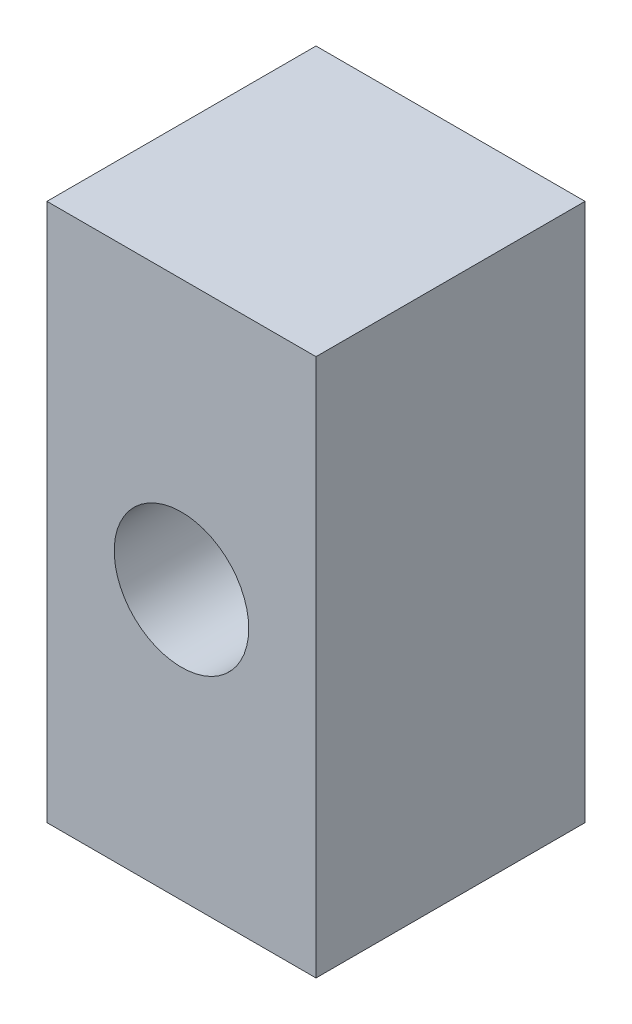
ISO-10303-21;
HEADER;
FILE_DESCRIPTION(('STEP AP214'),'2;1');
FILE_NAME('part.step','',(''),(''),'','','');
FILE_SCHEMA(('AUTOMOTIVE_DESIGN { 1 0 10303 214 1 1 1 1 }'));
ENDSEC;
DATA;
#1=APPLICATION_CONTEXT('core data for automotive mechanical design processes');
#2=APPLICATION_PROTOCOL_DEFINITION('international standard','automotive_design',2000,#1);
#3=PRODUCT_CONTEXT('',#1,'mechanical');
#4=PRODUCT('Part','Part','',(#3));
#5=PRODUCT_RELATED_PRODUCT_CATEGORY('part','',(#4));
#6=PRODUCT_DEFINITION_FORMATION('','',#4);
#7=PRODUCT_DEFINITION_CONTEXT('part definition',#1,'design');
#8=PRODUCT_DEFINITION('design','',#6,#7);
#9=PRODUCT_DEFINITION_SHAPE('','',#8);
#10=(LENGTH_UNIT() NAMED_UNIT(*) SI_UNIT(.MILLI.,.METRE.));
#11=(NAMED_UNIT(*) PLANE_ANGLE_UNIT() SI_UNIT($,.RADIAN.));
#12=(NAMED_UNIT(*) SI_UNIT($,.STERADIAN.) SOLID_ANGLE_UNIT());
#13=UNCERTAINTY_MEASURE_WITH_UNIT(LENGTH_MEASURE(1.E-05),#10,'distance_accuracy_value','');
#14=(GEOMETRIC_REPRESENTATION_CONTEXT(3) GLOBAL_UNCERTAINTY_ASSIGNED_CONTEXT((#13)) GLOBAL_UNIT_ASSIGNED_CONTEXT((#10,
#11,#12)) REPRESENTATION_CONTEXT('',''));
#15=CARTESIAN_POINT('',(0.,0.,0.));
#16=DIRECTION('',(0.,0.,1.));
#17=DIRECTION('',(1.,0.,0.));
#18=AXIS2_PLACEMENT_3D('',#15,#16,#17);
#19=CARTESIAN_POINT('',(0.,0.,50.8));
#20=DIRECTION('',(0.,0.,1.));
#21=DIRECTION('',(1.,0.,0.));
#22=AXIS2_PLACEMENT_3D('',#19,#20,#21);
#23=PLANE('',#22);
#24=DIRECTION('',(0.,-1.,0.));
#25=VECTOR('',#24,1.);
#26=CARTESIAN_POINT('',(-43.7730805506902,40.0458599995508,50.8));
#27=LINE('',#26,#25);
#28=CARTESIAN_POINT('',(-43.7730805506902,40.0458599995508,50.8));
#29=VERTEX_POINT('',#28);
#30=CARTESIAN_POINT('',(-43.7730805506902,-61.5541400004492,50.8));
#31=VERTEX_POINT('',#30);
#32=EDGE_CURVE('E85',#29,#31,#27,.T.);
#33=ORIENTED_EDGE('',*,*,#32,.T.);
#34=DIRECTION('',(1.,0.,0.));
#35=VECTOR('',#34,1.);
#36=CARTESIAN_POINT('',(-43.7730805506902,-61.5541400004492,50.8));
#37=LINE('',#36,#35);
#38=CARTESIAN_POINT('',(7.02691944930985,-61.5541400004492,50.8));
#39=VERTEX_POINT('',#38);
#40=EDGE_CURVE('E80',#31,#39,#37,.T.);
#41=ORIENTED_EDGE('',*,*,#40,.T.);
#42=DIRECTION('',(0.,1.,0.));
#43=VECTOR('',#42,1.);
#44=CARTESIAN_POINT('',(7.02691944930984,40.0458599995508,50.8));
#45=LINE('',#44,#43);
#46=CARTESIAN_POINT('',(7.02691944930984,40.0458599995508,50.8));
#47=VERTEX_POINT('',#46);
#48=EDGE_CURVE('E83',#39,#47,#45,.T.);
#49=ORIENTED_EDGE('',*,*,#48,.T.);
#50=DIRECTION('',(-1.,0.,0.));
#51=VECTOR('',#50,1.);
#52=CARTESIAN_POINT('',(-43.7730805506902,40.0458599995508,50.8));
#53=LINE('',#52,#51);
#54=EDGE_CURVE('E50',#47,#29,#53,.T.);
#55=ORIENTED_EDGE('',*,*,#54,.T.);
#56=EDGE_LOOP('',(#33,#41,#49,#55));
#57=FACE_BOUND('',#56,.T.);
#58=CARTESIAN_POINT('',(-18.3730805506902,-10.7541400004492,50.8));
#59=DIRECTION('',(0.,0.,1.));
#60=DIRECTION('',(1.,0.,0.));
#61=AXIS2_PLACEMENT_3D('',#58,#59,#60);
#62=CIRCLE('',#61,12.7);
#63=CARTESIAN_POINT('',(-5.67308055069015,-10.7541400004492,50.8));
#64=VERTEX_POINT('',#63);
#65=EDGE_CURVE('E100',#64,#64,#62,.T.);
#66=ORIENTED_EDGE('',*,*,#65,.F.);
#67=EDGE_LOOP('',(#66));
#68=FACE_BOUND('',#67,.T.);
#69=ADVANCED_FACE('F33',(#57,#68),#23,.T.);
#70=CARTESIAN_POINT('',(0.,0.,0.));
#71=DIRECTION('',(0.,0.,1.));
#72=DIRECTION('',(1.,0.,0.));
#73=AXIS2_PLACEMENT_3D('',#70,#71,#72);
#74=PLANE('',#73);
#75=DIRECTION('',(0.,-1.,0.));
#76=VECTOR('',#75,1.);
#77=CARTESIAN_POINT('',(-43.7730805506902,40.0458599995508,0.));
#78=LINE('',#77,#76);
#79=CARTESIAN_POINT('',(-43.7730805506902,40.0458599995508,0.));
#80=VERTEX_POINT('',#79);
#81=CARTESIAN_POINT('',(-43.7730805506902,-61.5541400004492,0.));
#82=VERTEX_POINT('',#81);
#83=EDGE_CURVE('E97',#80,#82,#78,.T.);
#84=ORIENTED_EDGE('',*,*,#83,.F.);
#85=DIRECTION('',(-1.,0.,0.));
#86=VECTOR('',#85,1.);
#87=CARTESIAN_POINT('',(-43.7730805506902,40.0458599995508,0.));
#88=LINE('',#87,#86);
#89=CARTESIAN_POINT('',(7.02691944930984,40.0458599995508,0.));
#90=VERTEX_POINT('',#89);
#91=EDGE_CURVE('E73',#90,#80,#88,.T.);
#92=ORIENTED_EDGE('',*,*,#91,.F.);
#93=DIRECTION('',(0.,1.,0.));
#94=VECTOR('',#93,1.);
#95=CARTESIAN_POINT('',(7.02691944930984,40.0458599995508,0.));
#96=LINE('',#95,#94);
#97=CARTESIAN_POINT('',(7.02691944930985,-61.5541400004492,0.));
#98=VERTEX_POINT('',#97);
#99=EDGE_CURVE('E67',#98,#90,#96,.T.);
#100=ORIENTED_EDGE('',*,*,#99,.F.);
#101=DIRECTION('',(1.,0.,0.));
#102=VECTOR('',#101,1.);
#103=CARTESIAN_POINT('',(-43.7730805506902,-61.5541400004492,0.));
#104=LINE('',#103,#102);
#105=EDGE_CURVE('E89',#82,#98,#104,.T.);
#106=ORIENTED_EDGE('',*,*,#105,.F.);
#107=EDGE_LOOP('',(#84,#92,#100,#106));
#108=FACE_BOUND('',#107,.T.);
#109=CARTESIAN_POINT('',(-18.3730805506902,-10.7541400004492,0.));
#110=DIRECTION('',(0.,0.,1.));
#111=DIRECTION('',(1.,0.,0.));
#112=AXIS2_PLACEMENT_3D('',#109,#110,#111);
#113=CIRCLE('',#112,12.7);
#114=CARTESIAN_POINT('',(-5.67308055069015,-10.7541400004492,0.));
#115=VERTEX_POINT('',#114);
#116=EDGE_CURVE('E112',#115,#115,#113,.T.);
#117=ORIENTED_EDGE('',*,*,#116,.T.);
#118=EDGE_LOOP('',(#117));
#119=FACE_BOUND('',#118,.T.);
#120=ADVANCED_FACE('F108',(#108,#119),#74,.F.);
#121=CARTESIAN_POINT('',(-43.7730805506902,40.0458599995508,50.8));
#122=DIRECTION('',(1.,0.,0.));
#123=DIRECTION('',(0.,0.,-1.));
#124=AXIS2_PLACEMENT_3D('',#121,#122,#123);
#125=PLANE('',#124);
#126=ORIENTED_EDGE('',*,*,#83,.T.);
#127=DIRECTION('',(0.,0.,-1.));
#128=VECTOR('',#127,1.);
#129=CARTESIAN_POINT('',(-43.7730805506902,-61.5541400004492,50.8));
#130=LINE('',#129,#128);
#131=EDGE_CURVE('E11',#31,#82,#130,.T.);
#132=ORIENTED_EDGE('',*,*,#131,.F.);
#133=ORIENTED_EDGE('',*,*,#32,.F.);
#134=DIRECTION('',(0.,0.,-1.));
#135=VECTOR('',#134,1.);
#136=CARTESIAN_POINT('',(-43.7730805506902,40.0458599995508,50.8));
#137=LINE('',#136,#135);
#138=EDGE_CURVE('E93',#29,#80,#137,.T.);
#139=ORIENTED_EDGE('',*,*,#138,.T.);
#140=EDGE_LOOP('',(#126,#132,#133,#139));
#141=FACE_BOUND('',#140,.T.);
#142=ADVANCED_FACE('F35',(#141),#125,.F.);
#143=CARTESIAN_POINT('',(-43.7730805506902,-61.5541400004492,50.8));
#144=DIRECTION('',(0.,1.,0.));
#145=DIRECTION('',(0.,0.,1.));
#146=AXIS2_PLACEMENT_3D('',#143,#144,#145);
#147=PLANE('',#146);
#148=ORIENTED_EDGE('',*,*,#105,.T.);
#149=DIRECTION('',(0.,0.,-1.));
#150=VECTOR('',#149,1.);
#151=CARTESIAN_POINT('',(7.02691944930985,-61.5541400004492,50.8));
#152=LINE('',#151,#150);
#153=EDGE_CURVE('E42',#39,#98,#152,.T.);
#154=ORIENTED_EDGE('',*,*,#153,.F.);
#155=ORIENTED_EDGE('',*,*,#40,.F.);
#156=ORIENTED_EDGE('',*,*,#131,.T.);
#157=EDGE_LOOP('',(#148,#154,#155,#156));
#158=FACE_BOUND('',#157,.T.);
#159=ADVANCED_FACE('F88',(#158),#147,.F.);
#160=CARTESIAN_POINT('',(7.02691944930984,40.0458599995508,50.8));
#161=DIRECTION('',(-1.,0.,0.));
#162=DIRECTION('',(0.,-1.,0.));
#163=AXIS2_PLACEMENT_3D('',#160,#161,#162);
#164=PLANE('',#163);
#165=ORIENTED_EDGE('',*,*,#99,.T.);
#166=DIRECTION('',(0.,0.,-1.));
#167=VECTOR('',#166,1.);
#168=CARTESIAN_POINT('',(7.02691944930984,40.0458599995508,50.8));
#169=LINE('',#168,#167);
#170=EDGE_CURVE('E90',#47,#90,#169,.T.);
#171=ORIENTED_EDGE('',*,*,#170,.F.);
#172=ORIENTED_EDGE('',*,*,#48,.F.);
#173=ORIENTED_EDGE('',*,*,#153,.T.);
#174=EDGE_LOOP('',(#165,#171,#172,#173));
#175=FACE_BOUND('',#174,.T.);
#176=ADVANCED_FACE('F91',(#175),#164,.F.);
#177=CARTESIAN_POINT('',(-43.7730805506902,40.0458599995508,50.8));
#178=DIRECTION('',(0.,-1.,0.));
#179=DIRECTION('',(0.,0.,-1.));
#180=AXIS2_PLACEMENT_3D('',#177,#178,#179);
#181=PLANE('',#180);
#182=ORIENTED_EDGE('',*,*,#91,.T.);
#183=ORIENTED_EDGE('',*,*,#138,.F.);
#184=ORIENTED_EDGE('',*,*,#54,.F.);
#185=ORIENTED_EDGE('',*,*,#170,.T.);
#186=EDGE_LOOP('',(#182,#183,#184,#185));
#187=FACE_BOUND('',#186,.T.);
#188=ADVANCED_FACE('F105',(#187),#181,.F.);
#189=CARTESIAN_POINT('',(-18.3730805506902,-10.7541400004492,50.8));
#190=DIRECTION('',(0.,0.,-1.));
#191=DIRECTION('',(-1.,0.,0.));
#192=AXIS2_PLACEMENT_3D('',#189,#190,#191);
#193=CYLINDRICAL_SURFACE('',#192,12.7);
#194=ORIENTED_EDGE('',*,*,#65,.T.);
#195=EDGE_LOOP('',(#194));
#196=FACE_BOUND('',#195,.T.);
#197=ORIENTED_EDGE('',*,*,#116,.F.);
#198=EDGE_LOOP('',(#197));
#199=FACE_BOUND('',#198,.T.);
#200=ADVANCED_FACE('F118',(#196,#199),#193,.F.);
#201=CLOSED_SHELL('',(#69,#120,#142,#159,#176,#188,#200));
#202=MANIFOLD_SOLID_BREP('B2',#201);
#203=ADVANCED_BREP_SHAPE_REPRESENTATION('',(#18,#202),#14);
#204=SHAPE_DEFINITION_REPRESENTATION(#9,#203);
ENDSEC;
END-ISO-10303-21;
